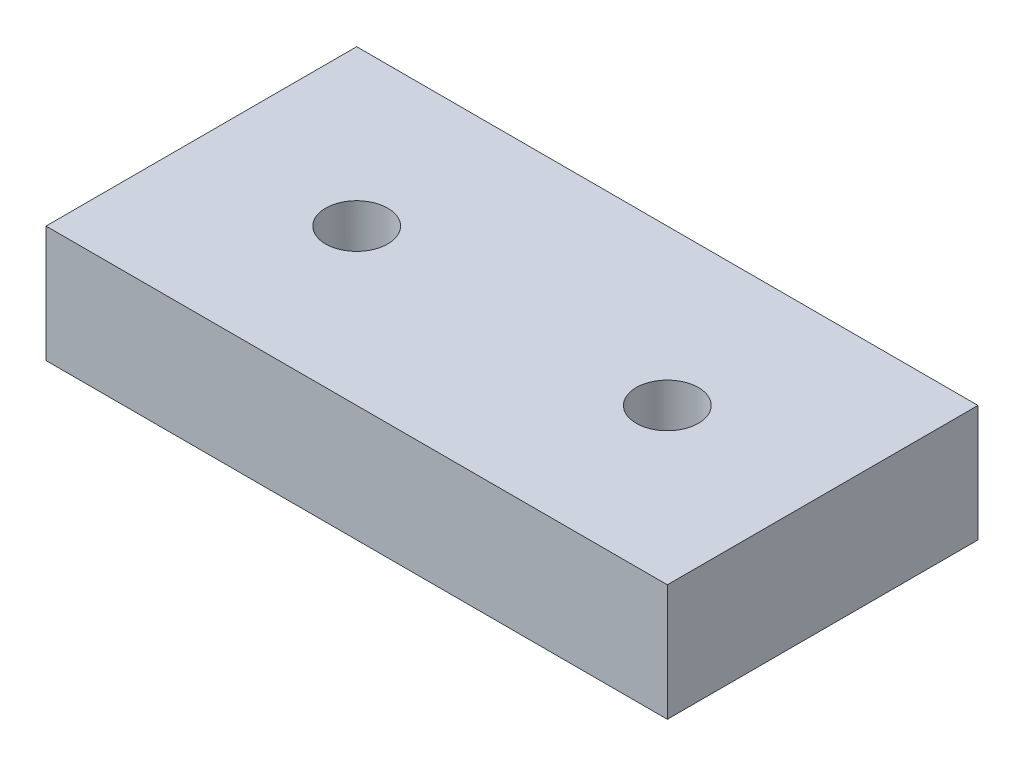
ISO-10303-21;
HEADER;
FILE_DESCRIPTION(('STEP AP214'),'2;1');
FILE_NAME('part.step','',(''),(''),'','','');
FILE_SCHEMA(('AUTOMOTIVE_DESIGN { 1 0 10303 214 1 1 1 1 }'));
ENDSEC;
DATA;
#1=APPLICATION_CONTEXT('core data for automotive mechanical design processes');
#2=APPLICATION_PROTOCOL_DEFINITION('international standard','automotive_design',2000,#1);
#3=PRODUCT_CONTEXT('',#1,'mechanical');
#4=PRODUCT('Part','Part','',(#3));
#5=PRODUCT_RELATED_PRODUCT_CATEGORY('part','',(#4));
#6=PRODUCT_DEFINITION_FORMATION('','',#4);
#7=PRODUCT_DEFINITION_CONTEXT('part definition',#1,'design');
#8=PRODUCT_DEFINITION('design','',#6,#7);
#9=PRODUCT_DEFINITION_SHAPE('','',#8);
#10=(LENGTH_UNIT() NAMED_UNIT(*) SI_UNIT(.MILLI.,.METRE.));
#11=(NAMED_UNIT(*) PLANE_ANGLE_UNIT() SI_UNIT($,.RADIAN.));
#12=(NAMED_UNIT(*) SI_UNIT($,.STERADIAN.) SOLID_ANGLE_UNIT());
#13=UNCERTAINTY_MEASURE_WITH_UNIT(LENGTH_MEASURE(1.E-05),#10,'distance_accuracy_value','');
#14=(GEOMETRIC_REPRESENTATION_CONTEXT(3) GLOBAL_UNCERTAINTY_ASSIGNED_CONTEXT((#13)) GLOBAL_UNIT_ASSIGNED_CONTEXT((#10,
#11,#12)) REPRESENTATION_CONTEXT('',''));
#15=CARTESIAN_POINT('',(0.,0.,0.));
#16=DIRECTION('',(0.,0.,1.));
#17=DIRECTION('',(1.,0.,0.));
#18=AXIS2_PLACEMENT_3D('',#15,#16,#17);
#19=CARTESIAN_POINT('',(0.,0.,0.));
#20=DIRECTION('',(0.,-1.,0.));
#21=DIRECTION('',(0.,0.,-1.));
#22=AXIS2_PLACEMENT_3D('',#19,#20,#21);
#23=PLANE('',#22);
#24=CARTESIAN_POINT('',(-9.99999999999999,0.,0.));
#25=DIRECTION('',(0.,-1.,0.));
#26=DIRECTION('',(0.,0.,-1.));
#27=AXIS2_PLACEMENT_3D('',#24,#25,#26);
#28=CIRCLE('',#27,6.);
#29=CARTESIAN_POINT('',(-9.99999999999999,0.,-6.));
#30=VERTEX_POINT('',#29);
#31=EDGE_CURVE('E264',#30,#30,#28,.T.);
#32=ORIENTED_EDGE('',*,*,#31,.F.);
#33=EDGE_LOOP('',(#32));
#34=FACE_BOUND('',#33,.T.);
#35=CARTESIAN_POINT('',(-9.99999999999999,0.,0.));
#36=DIRECTION('',(0.,-1.,0.));
#37=DIRECTION('',(0.,0.,-1.));
#38=AXIS2_PLACEMENT_3D('',#35,#36,#37);
#39=CIRCLE('',#38,7.);
#40=CARTESIAN_POINT('',(-9.99999999999999,0.,-7.));
#41=VERTEX_POINT('',#40);
#42=EDGE_CURVE('E252',#41,#41,#39,.T.);
#43=ORIENTED_EDGE('',*,*,#42,.T.);
#44=EDGE_LOOP('',(#43));
#45=FACE_BOUND('',#44,.T.);
#46=ADVANCED_FACE('F43',(#34,#45),#23,.T.);
#47=CARTESIAN_POINT('',(10.,0.,0.));
#48=DIRECTION('',(0.,-1.,0.));
#49=DIRECTION('',(0.,0.,-1.));
#50=AXIS2_PLACEMENT_3D('',#47,#48,#49);
#51=CIRCLE('',#50,6.);
#52=CARTESIAN_POINT('',(10.,0.,-6.));
#53=VERTEX_POINT('',#52);
#54=EDGE_CURVE('E267',#53,#53,#51,.T.);
#55=ORIENTED_EDGE('',*,*,#54,.F.);
#56=EDGE_LOOP('',(#55));
#57=FACE_BOUND('',#56,.T.);
#58=CARTESIAN_POINT('',(10.,0.,0.));
#59=DIRECTION('',(0.,-1.,0.));
#60=DIRECTION('',(0.,0.,-1.));
#61=AXIS2_PLACEMENT_3D('',#58,#59,#60);
#62=CIRCLE('',#61,7.);
#63=CARTESIAN_POINT('',(10.,0.,-7.));
#64=VERTEX_POINT('',#63);
#65=EDGE_CURVE('E249',#64,#64,#62,.T.);
#66=ORIENTED_EDGE('',*,*,#65,.T.);
#67=EDGE_LOOP('',(#66));
#68=FACE_BOUND('',#67,.T.);
#69=ADVANCED_FACE('F305',(#57,#68),#23,.T.);
#70=DIRECTION('',(0.,0.,1.));
#71=VECTOR('',#70,1.);
#72=CARTESIAN_POINT('',(-20.,0.,-10.));
#73=LINE('',#72,#71);
#74=CARTESIAN_POINT('',(-20.,0.,-10.));
#75=VERTEX_POINT('',#74);
#76=CARTESIAN_POINT('',(-20.,0.,10.));
#77=VERTEX_POINT('',#76);
#78=EDGE_CURVE('E156',#75,#77,#73,.T.);
#79=ORIENTED_EDGE('',*,*,#78,.F.);
#80=DIRECTION('',(-1.,0.,0.));
#81=VECTOR('',#80,1.);
#82=CARTESIAN_POINT('',(20.,0.,-10.));
#83=LINE('',#82,#81);
#84=CARTESIAN_POINT('',(20.,0.,-10.));
#85=VERTEX_POINT('',#84);
#86=EDGE_CURVE('E152',#85,#75,#83,.T.);
#87=ORIENTED_EDGE('',*,*,#86,.F.);
#88=DIRECTION('',(0.,0.,-1.));
#89=VECTOR('',#88,1.);
#90=CARTESIAN_POINT('',(20.,0.,-10.));
#91=LINE('',#90,#89);
#92=CARTESIAN_POINT('',(20.,0.,9.99999999999999));
#93=VERTEX_POINT('',#92);
#94=EDGE_CURVE('E283',#93,#85,#91,.T.);
#95=ORIENTED_EDGE('',*,*,#94,.F.);
#96=DIRECTION('',(1.,0.,0.));
#97=VECTOR('',#96,1.);
#98=CARTESIAN_POINT('',(20.,0.,9.99999999999999));
#99=LINE('',#98,#97);
#100=EDGE_CURVE('E281',#77,#93,#99,.T.);
#101=ORIENTED_EDGE('',*,*,#100,.F.);
#102=EDGE_LOOP('',(#79,#87,#95,#101));
#103=FACE_BOUND('',#102,.T.);
#104=DIRECTION('',(0.,0.,-1.));
#105=VECTOR('',#104,1.);
#106=CARTESIAN_POINT('',(19.,0.,0.));
#107=LINE('',#106,#105);
#108=CARTESIAN_POINT('',(19.,0.,4.99999999999999));
#109=VERTEX_POINT('',#108);
#110=CARTESIAN_POINT('',(19.,0.,-5.00000000000001));
#111=VERTEX_POINT('',#110);
#112=EDGE_CURVE('E203',#109,#111,#107,.T.);
#113=ORIENTED_EDGE('',*,*,#112,.T.);
#114=CARTESIAN_POINT('',(15.,0.,-5.00000000000001));
#115=DIRECTION('',(0.,-1.,0.));
#116=DIRECTION('',(0.,0.,-1.));
#117=AXIS2_PLACEMENT_3D('',#114,#115,#116);
#118=CIRCLE('',#117,4.);
#119=CARTESIAN_POINT('',(15.,0.,-9.00000000000001));
#120=VERTEX_POINT('',#119);
#121=EDGE_CURVE('E199',#111,#120,#118,.F.);
#122=ORIENTED_EDGE('',*,*,#121,.T.);
#123=DIRECTION('',(-1.,0.,0.));
#124=VECTOR('',#123,1.);
#125=CARTESIAN_POINT('',(0.,0.,-9.00000000000001));
#126=LINE('',#125,#124);
#127=CARTESIAN_POINT('',(-15.,0.,-9.00000000000001));
#128=VERTEX_POINT('',#127);
#129=EDGE_CURVE('E210',#120,#128,#126,.T.);
#130=ORIENTED_EDGE('',*,*,#129,.T.);
#131=CARTESIAN_POINT('',(-15.,0.,-5.));
#132=DIRECTION('',(0.,-1.,0.));
#133=DIRECTION('',(0.,0.,-1.));
#134=AXIS2_PLACEMENT_3D('',#131,#132,#133);
#135=CIRCLE('',#134,4.);
#136=CARTESIAN_POINT('',(-19.,0.,-5.));
#137=VERTEX_POINT('',#136);
#138=EDGE_CURVE('E197',#128,#137,#135,.F.);
#139=ORIENTED_EDGE('',*,*,#138,.T.);
#140=DIRECTION('',(0.,0.,1.));
#141=VECTOR('',#140,1.);
#142=CARTESIAN_POINT('',(-19.,0.,0.));
#143=LINE('',#142,#141);
#144=CARTESIAN_POINT('',(-19.,0.,5.));
#145=VERTEX_POINT('',#144);
#146=EDGE_CURVE('E255',#137,#145,#143,.T.);
#147=ORIENTED_EDGE('',*,*,#146,.T.);
#148=CARTESIAN_POINT('',(-15.,0.,5.));
#149=DIRECTION('',(0.,-1.,0.));
#150=DIRECTION('',(0.,0.,-1.));
#151=AXIS2_PLACEMENT_3D('',#148,#149,#150);
#152=CIRCLE('',#151,4.);
#153=CARTESIAN_POINT('',(-15.,0.,8.99999999999999));
#154=VERTEX_POINT('',#153);
#155=EDGE_CURVE('E11',#145,#154,#152,.F.);
#156=ORIENTED_EDGE('',*,*,#155,.T.);
#157=DIRECTION('',(1.,0.,0.));
#158=VECTOR('',#157,1.);
#159=CARTESIAN_POINT('',(0.,0.,8.99999999999999));
#160=LINE('',#159,#158);
#161=CARTESIAN_POINT('',(15.,0.,8.99999999999999));
#162=VERTEX_POINT('',#161);
#163=EDGE_CURVE('E204',#154,#162,#160,.T.);
#164=ORIENTED_EDGE('',*,*,#163,.T.);
#165=CARTESIAN_POINT('',(15.,0.,4.99999999999999));
#166=DIRECTION('',(0.,-1.,0.));
#167=DIRECTION('',(0.,0.,-1.));
#168=AXIS2_PLACEMENT_3D('',#165,#166,#167);
#169=CIRCLE('',#168,4.);
#170=EDGE_CURVE('E51',#162,#109,#169,.F.);
#171=ORIENTED_EDGE('',*,*,#170,.T.);
#172=EDGE_LOOP('',(#113,#122,#130,#139,#147,#156,#164,#171));
#173=FACE_BOUND('',#172,.T.);
#174=ADVANCED_FACE('F202',(#103,#173),#23,.T.);
#175=CARTESIAN_POINT('',(-9.99999999999999,7.5,0.));
#176=DIRECTION('',(0.,-1.,0.));
#177=DIRECTION('',(0.,0.,-1.));
#178=AXIS2_PLACEMENT_3D('',#175,#176,#177);
#179=CYLINDRICAL_SURFACE('',#178,2.);
#180=CARTESIAN_POINT('',(-9.99999999999999,7.5,0.));
#181=DIRECTION('',(0.,1.,0.));
#182=DIRECTION('',(0.,0.,1.));
#183=AXIS2_PLACEMENT_3D('',#180,#181,#182);
#184=CIRCLE('',#183,2.);
#185=CARTESIAN_POINT('',(-9.99999999999999,7.5,2.));
#186=VERTEX_POINT('',#185);
#187=EDGE_CURVE('E274',#186,#186,#184,.T.);
#188=ORIENTED_EDGE('',*,*,#187,.T.);
#189=EDGE_LOOP('',(#188));
#190=FACE_BOUND('',#189,.T.);
#191=CARTESIAN_POINT('',(-9.99999999999999,4.,0.));
#192=DIRECTION('',(0.,-1.,0.));
#193=DIRECTION('',(0.,0.,-1.));
#194=AXIS2_PLACEMENT_3D('',#191,#192,#193);
#195=CIRCLE('',#194,2.);
#196=CARTESIAN_POINT('',(-9.99999999999999,4.,-2.));
#197=VERTEX_POINT('',#196);
#198=EDGE_CURVE('E168',#197,#197,#195,.T.);
#199=ORIENTED_EDGE('',*,*,#198,.T.);
#200=EDGE_LOOP('',(#199));
#201=FACE_BOUND('',#200,.T.);
#202=ADVANCED_FACE('F317',(#190,#201),#179,.F.);
#203=CARTESIAN_POINT('',(10.,7.5,0.));
#204=DIRECTION('',(0.,-1.,0.));
#205=DIRECTION('',(0.,0.,-1.));
#206=AXIS2_PLACEMENT_3D('',#203,#204,#205);
#207=CYLINDRICAL_SURFACE('',#206,2.);
#208=CARTESIAN_POINT('',(10.,7.5,0.));
#209=DIRECTION('',(0.,1.,0.));
#210=DIRECTION('',(0.,0.,1.));
#211=AXIS2_PLACEMENT_3D('',#208,#209,#210);
#212=CIRCLE('',#211,2.);
#213=CARTESIAN_POINT('',(10.,7.5,2.));
#214=VERTEX_POINT('',#213);
#215=EDGE_CURVE('E171',#214,#214,#212,.T.);
#216=ORIENTED_EDGE('',*,*,#215,.T.);
#217=EDGE_LOOP('',(#216));
#218=FACE_BOUND('',#217,.T.);
#219=CARTESIAN_POINT('',(10.,4.,0.));
#220=DIRECTION('',(0.,-1.,0.));
#221=DIRECTION('',(0.,0.,-1.));
#222=AXIS2_PLACEMENT_3D('',#219,#220,#221);
#223=CIRCLE('',#222,2.);
#224=CARTESIAN_POINT('',(10.,4.,-2.));
#225=VERTEX_POINT('',#224);
#226=EDGE_CURVE('E165',#225,#225,#223,.T.);
#227=ORIENTED_EDGE('',*,*,#226,.T.);
#228=EDGE_LOOP('',(#227));
#229=FACE_BOUND('',#228,.T.);
#230=ADVANCED_FACE('F321',(#218,#229),#207,.F.);
#231=CARTESIAN_POINT('',(0.,7.5,0.));
#232=DIRECTION('',(0.,-1.,0.));
#233=DIRECTION('',(0.,0.,-1.));
#234=AXIS2_PLACEMENT_3D('',#231,#232,#233);
#235=PLANE('',#234);
#236=DIRECTION('',(0.,0.,1.));
#237=VECTOR('',#236,1.);
#238=CARTESIAN_POINT('',(-20.,7.5,-10.));
#239=LINE('',#238,#237);
#240=CARTESIAN_POINT('',(-20.,7.5,-10.));
#241=VERTEX_POINT('',#240);
#242=CARTESIAN_POINT('',(-20.,7.5,10.));
#243=VERTEX_POINT('',#242);
#244=EDGE_CURVE('E142',#241,#243,#239,.T.);
#245=ORIENTED_EDGE('',*,*,#244,.T.);
#246=DIRECTION('',(1.,0.,0.));
#247=VECTOR('',#246,1.);
#248=CARTESIAN_POINT('',(20.,7.5,9.99999999999999));
#249=LINE('',#248,#247);
#250=CARTESIAN_POINT('',(20.,7.5,9.99999999999999));
#251=VERTEX_POINT('',#250);
#252=EDGE_CURVE('E131',#243,#251,#249,.T.);
#253=ORIENTED_EDGE('',*,*,#252,.T.);
#254=DIRECTION('',(0.,0.,-1.));
#255=VECTOR('',#254,1.);
#256=CARTESIAN_POINT('',(20.,7.5,-10.));
#257=LINE('',#256,#255);
#258=CARTESIAN_POINT('',(20.,7.5,-10.));
#259=VERTEX_POINT('',#258);
#260=EDGE_CURVE('E141',#251,#259,#257,.T.);
#261=ORIENTED_EDGE('',*,*,#260,.T.);
#262=DIRECTION('',(-1.,0.,0.));
#263=VECTOR('',#262,1.);
#264=CARTESIAN_POINT('',(20.,7.5,-10.));
#265=LINE('',#264,#263);
#266=EDGE_CURVE('E148',#259,#241,#265,.T.);
#267=ORIENTED_EDGE('',*,*,#266,.T.);
#268=EDGE_LOOP('',(#245,#253,#261,#267));
#269=FACE_BOUND('',#268,.T.);
#270=ORIENTED_EDGE('',*,*,#187,.F.);
#271=EDGE_LOOP('',(#270));
#272=FACE_BOUND('',#271,.T.);
#273=ORIENTED_EDGE('',*,*,#215,.F.);
#274=EDGE_LOOP('',(#273));
#275=FACE_BOUND('',#274,.T.);
#276=ADVANCED_FACE('F145',(#269,#272,#275),#235,.F.);
#277=CARTESIAN_POINT('',(-20.,7.5,-10.));
#278=DIRECTION('',(1.,0.,0.));
#279=DIRECTION('',(0.,0.,-1.));
#280=AXIS2_PLACEMENT_3D('',#277,#278,#279);
#281=PLANE('',#280);
#282=ORIENTED_EDGE('',*,*,#78,.T.);
#283=DIRECTION('',(0.,-1.,0.));
#284=VECTOR('',#283,1.);
#285=CARTESIAN_POINT('',(-20.,7.5,10.));
#286=LINE('',#285,#284);
#287=EDGE_CURVE('E135',#243,#77,#286,.T.);
#288=ORIENTED_EDGE('',*,*,#287,.F.);
#289=ORIENTED_EDGE('',*,*,#244,.F.);
#290=DIRECTION('',(0.,-1.,0.));
#291=VECTOR('',#290,1.);
#292=CARTESIAN_POINT('',(-20.,7.5,-10.));
#293=LINE('',#292,#291);
#294=EDGE_CURVE('E279',#241,#75,#293,.T.);
#295=ORIENTED_EDGE('',*,*,#294,.T.);
#296=EDGE_LOOP('',(#282,#288,#289,#295));
#297=FACE_BOUND('',#296,.T.);
#298=ADVANCED_FACE('F154',(#297),#281,.F.);
#299=CARTESIAN_POINT('',(20.,7.5,9.99999999999999));
#300=DIRECTION('',(0.,0.,-1.));
#301=DIRECTION('',(-1.,0.,0.));
#302=AXIS2_PLACEMENT_3D('',#299,#300,#301);
#303=PLANE('',#302);
#304=ORIENTED_EDGE('',*,*,#100,.T.);
#305=DIRECTION('',(0.,-1.,0.));
#306=VECTOR('',#305,1.);
#307=CARTESIAN_POINT('',(20.,7.5,9.99999999999999));
#308=LINE('',#307,#306);
#309=EDGE_CURVE('E138',#251,#93,#308,.T.);
#310=ORIENTED_EDGE('',*,*,#309,.F.);
#311=ORIENTED_EDGE('',*,*,#252,.F.);
#312=ORIENTED_EDGE('',*,*,#287,.T.);
#313=EDGE_LOOP('',(#304,#310,#311,#312));
#314=FACE_BOUND('',#313,.T.);
#315=ADVANCED_FACE('F133',(#314),#303,.F.);
#316=CARTESIAN_POINT('',(20.,7.5,-10.));
#317=DIRECTION('',(-1.,0.,0.));
#318=DIRECTION('',(0.,0.,1.));
#319=AXIS2_PLACEMENT_3D('',#316,#317,#318);
#320=PLANE('',#319);
#321=ORIENTED_EDGE('',*,*,#94,.T.);
#322=DIRECTION('',(0.,-1.,0.));
#323=VECTOR('',#322,1.);
#324=CARTESIAN_POINT('',(20.,7.5,-10.));
#325=LINE('',#324,#323);
#326=EDGE_CURVE('E161',#259,#85,#325,.T.);
#327=ORIENTED_EDGE('',*,*,#326,.F.);
#328=ORIENTED_EDGE('',*,*,#260,.F.);
#329=ORIENTED_EDGE('',*,*,#309,.T.);
#330=EDGE_LOOP('',(#321,#327,#328,#329));
#331=FACE_BOUND('',#330,.T.);
#332=ADVANCED_FACE('F294',(#331),#320,.F.);
#333=CARTESIAN_POINT('',(20.,7.5,-10.));
#334=DIRECTION('',(0.,0.,1.));
#335=DIRECTION('',(1.,0.,0.));
#336=AXIS2_PLACEMENT_3D('',#333,#334,#335);
#337=PLANE('',#336);
#338=ORIENTED_EDGE('',*,*,#86,.T.);
#339=ORIENTED_EDGE('',*,*,#294,.F.);
#340=ORIENTED_EDGE('',*,*,#266,.F.);
#341=ORIENTED_EDGE('',*,*,#326,.T.);
#342=EDGE_LOOP('',(#338,#339,#340,#341));
#343=FACE_BOUND('',#342,.T.);
#344=ADVANCED_FACE('F290',(#343),#337,.F.);
#345=CARTESIAN_POINT('',(10.,4.,0.));
#346=DIRECTION('',(0.,-1.,0.));
#347=DIRECTION('',(0.,0.,-1.));
#348=AXIS2_PLACEMENT_3D('',#345,#346,#347);
#349=CYLINDRICAL_SURFACE('',#348,6.);
#350=CARTESIAN_POINT('',(10.,4.,0.));
#351=DIRECTION('',(0.,-1.,0.));
#352=DIRECTION('',(0.,0.,-1.));
#353=AXIS2_PLACEMENT_3D('',#350,#351,#352);
#354=CIRCLE('',#353,6.);
#355=CARTESIAN_POINT('',(10.,4.,-6.));
#356=VERTEX_POINT('',#355);
#357=EDGE_CURVE('E236',#356,#356,#354,.T.);
#358=ORIENTED_EDGE('',*,*,#357,.F.);
#359=EDGE_LOOP('',(#358));
#360=FACE_BOUND('',#359,.T.);
#361=ORIENTED_EDGE('',*,*,#54,.T.);
#362=EDGE_LOOP('',(#361));
#363=FACE_BOUND('',#362,.T.);
#364=ADVANCED_FACE('F301',(#360,#363),#349,.F.);
#365=CARTESIAN_POINT('',(10.,4.,0.));
#366=DIRECTION('',(0.,-1.,0.));
#367=DIRECTION('',(0.,0.,-1.));
#368=AXIS2_PLACEMENT_3D('',#365,#366,#367);
#369=PLANE('',#368);
#370=ORIENTED_EDGE('',*,*,#226,.F.);
#371=EDGE_LOOP('',(#370));
#372=FACE_BOUND('',#371,.T.);
#373=ORIENTED_EDGE('',*,*,#357,.T.);
#374=EDGE_LOOP('',(#373));
#375=FACE_BOUND('',#374,.T.);
#376=ADVANCED_FACE('F398',(#372,#375),#369,.T.);
#377=CARTESIAN_POINT('',(-9.99999999999999,4.,0.));
#378=DIRECTION('',(0.,-1.,0.));
#379=DIRECTION('',(0.,0.,-1.));
#380=AXIS2_PLACEMENT_3D('',#377,#378,#379);
#381=CYLINDRICAL_SURFACE('',#380,6.);
#382=CARTESIAN_POINT('',(-9.99999999999999,4.,0.));
#383=DIRECTION('',(0.,-1.,0.));
#384=DIRECTION('',(0.,0.,-1.));
#385=AXIS2_PLACEMENT_3D('',#382,#383,#384);
#386=CIRCLE('',#385,6.);
#387=CARTESIAN_POINT('',(-9.99999999999999,4.,-6.));
#388=VERTEX_POINT('',#387);
#389=EDGE_CURVE('E169',#388,#388,#386,.T.);
#390=ORIENTED_EDGE('',*,*,#389,.F.);
#391=EDGE_LOOP('',(#390));
#392=FACE_BOUND('',#391,.T.);
#393=ORIENTED_EDGE('',*,*,#31,.T.);
#394=EDGE_LOOP('',(#393));
#395=FACE_BOUND('',#394,.T.);
#396=ADVANCED_FACE('F394',(#392,#395),#381,.F.);
#397=CARTESIAN_POINT('',(-9.99999999999999,4.,0.));
#398=DIRECTION('',(0.,-1.,0.));
#399=DIRECTION('',(0.,0.,-1.));
#400=AXIS2_PLACEMENT_3D('',#397,#398,#399);
#401=PLANE('',#400);
#402=ORIENTED_EDGE('',*,*,#198,.F.);
#403=EDGE_LOOP('',(#402));
#404=FACE_BOUND('',#403,.T.);
#405=ORIENTED_EDGE('',*,*,#389,.T.);
#406=EDGE_LOOP('',(#405));
#407=FACE_BOUND('',#406,.T.);
#408=ADVANCED_FACE('F390',(#404,#407),#401,.T.);
#409=CARTESIAN_POINT('',(-9.99999999999999,7.5,0.));
#410=DIRECTION('',(0.,-1.,0.));
#411=DIRECTION('',(0.,0.,-1.));
#412=AXIS2_PLACEMENT_3D('',#409,#410,#411);
#413=CYLINDRICAL_SURFACE('',#412,3.);
#414=CARTESIAN_POINT('',(-9.99999999999999,6.5,0.));
#415=DIRECTION('',(0.,-1.,0.));
#416=DIRECTION('',(0.,0.,-1.));
#417=AXIS2_PLACEMENT_3D('',#414,#415,#416);
#418=CIRCLE('',#417,3.);
#419=CARTESIAN_POINT('',(-9.99999999999999,6.5,-3.));
#420=VERTEX_POINT('',#419);
#421=EDGE_CURVE('E240',#420,#420,#418,.F.);
#422=ORIENTED_EDGE('',*,*,#421,.F.);
#423=EDGE_LOOP('',(#422));
#424=FACE_BOUND('',#423,.T.);
#425=CARTESIAN_POINT('',(-9.99999999999999,5.,0.));
#426=DIRECTION('',(0.,-1.,0.));
#427=DIRECTION('',(0.,0.,-1.));
#428=AXIS2_PLACEMENT_3D('',#425,#426,#427);
#429=CIRCLE('',#428,3.);
#430=CARTESIAN_POINT('',(-9.99999999999999,5.,-3.));
#431=VERTEX_POINT('',#430);
#432=EDGE_CURVE('E241',#431,#431,#429,.T.);
#433=ORIENTED_EDGE('',*,*,#432,.F.);
#434=EDGE_LOOP('',(#433));
#435=FACE_BOUND('',#434,.T.);
#436=ADVANCED_FACE('F393',(#424,#435),#413,.T.);
#437=CARTESIAN_POINT('',(10.,7.5,0.));
#438=DIRECTION('',(0.,-1.,0.));
#439=DIRECTION('',(0.,0.,-1.));
#440=AXIS2_PLACEMENT_3D('',#437,#438,#439);
#441=CYLINDRICAL_SURFACE('',#440,3.);
#442=CARTESIAN_POINT('',(10.,6.5,0.));
#443=DIRECTION('',(0.,-1.,0.));
#444=DIRECTION('',(0.,0.,-1.));
#445=AXIS2_PLACEMENT_3D('',#442,#443,#444);
#446=CIRCLE('',#445,3.);
#447=CARTESIAN_POINT('',(10.,6.5,-3.));
#448=VERTEX_POINT('',#447);
#449=EDGE_CURVE('E237',#448,#448,#446,.F.);
#450=ORIENTED_EDGE('',*,*,#449,.F.);
#451=EDGE_LOOP('',(#450));
#452=FACE_BOUND('',#451,.T.);
#453=CARTESIAN_POINT('',(10.,5.,0.));
#454=DIRECTION('',(0.,-1.,0.));
#455=DIRECTION('',(0.,0.,-1.));
#456=AXIS2_PLACEMENT_3D('',#453,#454,#455);
#457=CIRCLE('',#456,3.);
#458=CARTESIAN_POINT('',(10.,5.,-3.));
#459=VERTEX_POINT('',#458);
#460=EDGE_CURVE('E242',#459,#459,#457,.T.);
#461=ORIENTED_EDGE('',*,*,#460,.F.);
#462=EDGE_LOOP('',(#461));
#463=FACE_BOUND('',#462,.T.);
#464=ADVANCED_FACE('F449',(#452,#463),#441,.T.);
#465=CARTESIAN_POINT('',(0.,6.5,0.));
#466=DIRECTION('',(0.,-1.,0.));
#467=DIRECTION('',(0.,0.,-1.));
#468=AXIS2_PLACEMENT_3D('',#465,#466,#467);
#469=PLANE('',#468);
#470=DIRECTION('',(0.,0.,1.));
#471=VECTOR('',#470,1.);
#472=CARTESIAN_POINT('',(-19.,6.5,0.));
#473=LINE('',#472,#471);
#474=CARTESIAN_POINT('',(-19.,6.5,-5.));
#475=VERTEX_POINT('',#474);
#476=CARTESIAN_POINT('',(-19.,6.5,5.));
#477=VERTEX_POINT('',#476);
#478=EDGE_CURVE('E226',#475,#477,#473,.T.);
#479=ORIENTED_EDGE('',*,*,#478,.F.);
#480=CARTESIAN_POINT('',(-15.,6.5,-5.));
#481=DIRECTION('',(0.,-1.,0.));
#482=DIRECTION('',(0.,0.,-1.));
#483=AXIS2_PLACEMENT_3D('',#480,#481,#482);
#484=CIRCLE('',#483,4.);
#485=CARTESIAN_POINT('',(-15.,6.5,-9.00000000000001));
#486=VERTEX_POINT('',#485);
#487=EDGE_CURVE('E186',#475,#486,#484,.T.);
#488=ORIENTED_EDGE('',*,*,#487,.T.);
#489=DIRECTION('',(-1.,0.,0.));
#490=VECTOR('',#489,1.);
#491=CARTESIAN_POINT('',(0.,6.5,-9.00000000000001));
#492=LINE('',#491,#490);
#493=CARTESIAN_POINT('',(15.,6.5,-9.00000000000001));
#494=VERTEX_POINT('',#493);
#495=EDGE_CURVE('E228',#494,#486,#492,.T.);
#496=ORIENTED_EDGE('',*,*,#495,.F.);
#497=CARTESIAN_POINT('',(15.,6.5,-5.00000000000001));
#498=DIRECTION('',(0.,-1.,0.));
#499=DIRECTION('',(0.,0.,-1.));
#500=AXIS2_PLACEMENT_3D('',#497,#498,#499);
#501=CIRCLE('',#500,4.);
#502=CARTESIAN_POINT('',(19.,6.5,-5.00000000000001));
#503=VERTEX_POINT('',#502);
#504=EDGE_CURVE('E184',#494,#503,#501,.T.);
#505=ORIENTED_EDGE('',*,*,#504,.T.);
#506=DIRECTION('',(0.,0.,-1.));
#507=VECTOR('',#506,1.);
#508=CARTESIAN_POINT('',(19.,6.5,0.));
#509=LINE('',#508,#507);
#510=CARTESIAN_POINT('',(19.,6.5,4.99999999999999));
#511=VERTEX_POINT('',#510);
#512=EDGE_CURVE('E222',#511,#503,#509,.T.);
#513=ORIENTED_EDGE('',*,*,#512,.F.);
#514=CARTESIAN_POINT('',(15.,6.5,4.99999999999999));
#515=DIRECTION('',(0.,-1.,0.));
#516=DIRECTION('',(0.,0.,-1.));
#517=AXIS2_PLACEMENT_3D('',#514,#515,#516);
#518=CIRCLE('',#517,4.);
#519=CARTESIAN_POINT('',(15.,6.5,8.99999999999999));
#520=VERTEX_POINT('',#519);
#521=EDGE_CURVE('E182',#511,#520,#518,.T.);
#522=ORIENTED_EDGE('',*,*,#521,.T.);
#523=DIRECTION('',(1.,0.,0.));
#524=VECTOR('',#523,1.);
#525=CARTESIAN_POINT('',(0.,6.5,8.99999999999999));
#526=LINE('',#525,#524);
#527=CARTESIAN_POINT('',(-15.,6.5,8.99999999999999));
#528=VERTEX_POINT('',#527);
#529=EDGE_CURVE('E220',#528,#520,#526,.T.);
#530=ORIENTED_EDGE('',*,*,#529,.F.);
#531=CARTESIAN_POINT('',(-15.,6.5,5.));
#532=DIRECTION('',(0.,-1.,0.));
#533=DIRECTION('',(0.,0.,-1.));
#534=AXIS2_PLACEMENT_3D('',#531,#532,#533);
#535=CIRCLE('',#534,4.);
#536=EDGE_CURVE('E180',#528,#477,#535,.T.);
#537=ORIENTED_EDGE('',*,*,#536,.T.);
#538=EDGE_LOOP('',(#479,#488,#496,#505,#513,#522,#530,#537));
#539=FACE_BOUND('',#538,.T.);
#540=ORIENTED_EDGE('',*,*,#421,.T.);
#541=EDGE_LOOP('',(#540));
#542=FACE_BOUND('',#541,.T.);
#543=ORIENTED_EDGE('',*,*,#449,.T.);
#544=EDGE_LOOP('',(#543));
#545=FACE_BOUND('',#544,.T.);
#546=ADVANCED_FACE('F218',(#539,#542,#545),#469,.T.);
#547=CARTESIAN_POINT('',(-19.,7.5,-10.));
#548=DIRECTION('',(1.,0.,0.));
#549=DIRECTION('',(0.,0.,-1.));
#550=AXIS2_PLACEMENT_3D('',#547,#548,#549);
#551=PLANE('',#550);
#552=ORIENTED_EDGE('',*,*,#146,.F.);
#553=DIRECTION('',(0.,-1.,0.));
#554=VECTOR('',#553,1.);
#555=CARTESIAN_POINT('',(-19.,6.5,-5.));
#556=LINE('',#555,#554);
#557=EDGE_CURVE('E178',#137,#475,#556,.F.);
#558=ORIENTED_EDGE('',*,*,#557,.T.);
#559=ORIENTED_EDGE('',*,*,#478,.T.);
#560=DIRECTION('',(0.,-1.,0.));
#561=VECTOR('',#560,1.);
#562=CARTESIAN_POINT('',(-19.,0.,5.));
#563=LINE('',#562,#561);
#564=EDGE_CURVE('E175',#477,#145,#563,.T.);
#565=ORIENTED_EDGE('',*,*,#564,.T.);
#566=EDGE_LOOP('',(#552,#558,#559,#565));
#567=FACE_BOUND('',#566,.T.);
#568=ADVANCED_FACE('F358',(#567),#551,.T.);
#569=CARTESIAN_POINT('',(20.,7.5,8.99999999999999));
#570=DIRECTION('',(0.,0.,-1.));
#571=DIRECTION('',(-1.,0.,0.));
#572=AXIS2_PLACEMENT_3D('',#569,#570,#571);
#573=PLANE('',#572);
#574=ORIENTED_EDGE('',*,*,#529,.T.);
#575=DIRECTION('',(0.,-1.,0.));
#576=VECTOR('',#575,1.);
#577=CARTESIAN_POINT('',(15.,0.,8.99999999999999));
#578=LINE('',#577,#576);
#579=EDGE_CURVE('E195',#520,#162,#578,.T.);
#580=ORIENTED_EDGE('',*,*,#579,.T.);
#581=ORIENTED_EDGE('',*,*,#163,.F.);
#582=DIRECTION('',(0.,-1.,0.));
#583=VECTOR('',#582,1.);
#584=CARTESIAN_POINT('',(-15.,6.5,9.));
#585=LINE('',#584,#583);
#586=EDGE_CURVE('E193',#154,#528,#585,.F.);
#587=ORIENTED_EDGE('',*,*,#586,.T.);
#588=EDGE_LOOP('',(#574,#580,#581,#587));
#589=FACE_BOUND('',#588,.T.);
#590=ADVANCED_FACE('F224',(#589),#573,.T.);
#591=CARTESIAN_POINT('',(19.,7.5,-10.));
#592=DIRECTION('',(-1.,0.,0.));
#593=DIRECTION('',(0.,0.,1.));
#594=AXIS2_PLACEMENT_3D('',#591,#592,#593);
#595=PLANE('',#594);
#596=ORIENTED_EDGE('',*,*,#512,.T.);
#597=DIRECTION('',(0.,-1.,0.));
#598=VECTOR('',#597,1.);
#599=CARTESIAN_POINT('',(19.,0.,-5.00000000000001));
#600=LINE('',#599,#598);
#601=EDGE_CURVE('E190',#503,#111,#600,.T.);
#602=ORIENTED_EDGE('',*,*,#601,.T.);
#603=ORIENTED_EDGE('',*,*,#112,.F.);
#604=DIRECTION('',(0.,-1.,0.));
#605=VECTOR('',#604,1.);
#606=CARTESIAN_POINT('',(19.,6.5,4.99999999999999));
#607=LINE('',#606,#605);
#608=EDGE_CURVE('E188',#109,#511,#607,.F.);
#609=ORIENTED_EDGE('',*,*,#608,.T.);
#610=EDGE_LOOP('',(#596,#602,#603,#609));
#611=FACE_BOUND('',#610,.T.);
#612=ADVANCED_FACE('F207',(#611),#595,.T.);
#613=CARTESIAN_POINT('',(20.,7.5,-9.00000000000001));
#614=DIRECTION('',(0.,0.,1.));
#615=DIRECTION('',(1.,0.,0.));
#616=AXIS2_PLACEMENT_3D('',#613,#614,#615);
#617=PLANE('',#616);
#618=ORIENTED_EDGE('',*,*,#495,.T.);
#619=DIRECTION('',(0.,-1.,0.));
#620=VECTOR('',#619,1.);
#621=CARTESIAN_POINT('',(-15.,0.,-9.));
#622=LINE('',#621,#620);
#623=EDGE_CURVE('E159',#486,#128,#622,.T.);
#624=ORIENTED_EDGE('',*,*,#623,.T.);
#625=ORIENTED_EDGE('',*,*,#129,.F.);
#626=DIRECTION('',(0.,-1.,0.));
#627=VECTOR('',#626,1.);
#628=CARTESIAN_POINT('',(15.,6.5,-9.00000000000001));
#629=LINE('',#628,#627);
#630=EDGE_CURVE('E157',#120,#494,#629,.F.);
#631=ORIENTED_EDGE('',*,*,#630,.T.);
#632=EDGE_LOOP('',(#618,#624,#625,#631));
#633=FACE_BOUND('',#632,.T.);
#634=ADVANCED_FACE('F364',(#633),#617,.T.);
#635=CARTESIAN_POINT('',(10.,4.,0.));
#636=DIRECTION('',(0.,-1.,0.));
#637=DIRECTION('',(0.,0.,-1.));
#638=AXIS2_PLACEMENT_3D('',#635,#636,#637);
#639=CYLINDRICAL_SURFACE('',#638,7.);
#640=CARTESIAN_POINT('',(10.,5.,0.));
#641=DIRECTION('',(0.,-1.,0.));
#642=DIRECTION('',(0.,0.,-1.));
#643=AXIS2_PLACEMENT_3D('',#640,#641,#642);
#644=CIRCLE('',#643,7.);
#645=CARTESIAN_POINT('',(10.,5.,-7.));
#646=VERTEX_POINT('',#645);
#647=EDGE_CURVE('E246',#646,#646,#644,.T.);
#648=ORIENTED_EDGE('',*,*,#647,.T.);
#649=EDGE_LOOP('',(#648));
#650=FACE_BOUND('',#649,.T.);
#651=ORIENTED_EDGE('',*,*,#65,.F.);
#652=EDGE_LOOP('',(#651));
#653=FACE_BOUND('',#652,.T.);
#654=ADVANCED_FACE('F368',(#650,#653),#639,.T.);
#655=CARTESIAN_POINT('',(10.,5.,0.));
#656=DIRECTION('',(0.,-1.,0.));
#657=DIRECTION('',(0.,0.,-1.));
#658=AXIS2_PLACEMENT_3D('',#655,#656,#657);
#659=PLANE('',#658);
#660=ORIENTED_EDGE('',*,*,#460,.T.);
#661=EDGE_LOOP('',(#660));
#662=FACE_BOUND('',#661,.T.);
#663=ORIENTED_EDGE('',*,*,#647,.F.);
#664=EDGE_LOOP('',(#663));
#665=FACE_BOUND('',#664,.T.);
#666=ADVANCED_FACE('F374',(#662,#665),#659,.F.);
#667=CARTESIAN_POINT('',(-9.99999999999999,4.,0.));
#668=DIRECTION('',(0.,-1.,0.));
#669=DIRECTION('',(0.,0.,-1.));
#670=AXIS2_PLACEMENT_3D('',#667,#668,#669);
#671=CYLINDRICAL_SURFACE('',#670,7.);
#672=CARTESIAN_POINT('',(-9.99999999999999,5.,0.));
#673=DIRECTION('',(0.,-1.,0.));
#674=DIRECTION('',(0.,0.,-1.));
#675=AXIS2_PLACEMENT_3D('',#672,#673,#674);
#676=CIRCLE('',#675,7.);
#677=CARTESIAN_POINT('',(-9.99999999999999,5.,-7.));
#678=VERTEX_POINT('',#677);
#679=EDGE_CURVE('E245',#678,#678,#676,.T.);
#680=ORIENTED_EDGE('',*,*,#679,.T.);
#681=EDGE_LOOP('',(#680));
#682=FACE_BOUND('',#681,.T.);
#683=ORIENTED_EDGE('',*,*,#42,.F.);
#684=EDGE_LOOP('',(#683));
#685=FACE_BOUND('',#684,.T.);
#686=ADVANCED_FACE('F382',(#682,#685),#671,.T.);
#687=CARTESIAN_POINT('',(-9.99999999999999,5.,0.));
#688=DIRECTION('',(0.,-1.,0.));
#689=DIRECTION('',(0.,0.,-1.));
#690=AXIS2_PLACEMENT_3D('',#687,#688,#689);
#691=PLANE('',#690);
#692=ORIENTED_EDGE('',*,*,#432,.T.);
#693=EDGE_LOOP('',(#692));
#694=FACE_BOUND('',#693,.T.);
#695=ORIENTED_EDGE('',*,*,#679,.F.);
#696=EDGE_LOOP('',(#695));
#697=FACE_BOUND('',#696,.T.);
#698=ADVANCED_FACE('F343',(#694,#697),#691,.F.);
#699=CARTESIAN_POINT('',(-15.,7.5,-5.));
#700=DIRECTION('',(0.,1.,0.));
#701=DIRECTION('',(0.,0.,1.));
#702=AXIS2_PLACEMENT_3D('',#699,#700,#701);
#703=CYLINDRICAL_SURFACE('',#702,4.);
#704=ORIENTED_EDGE('',*,*,#487,.F.);
#705=ORIENTED_EDGE('',*,*,#557,.F.);
#706=ORIENTED_EDGE('',*,*,#138,.F.);
#707=ORIENTED_EDGE('',*,*,#623,.F.);
#708=EDGE_LOOP('',(#704,#705,#706,#707));
#709=FACE_BOUND('',#708,.T.);
#710=ADVANCED_FACE('F339',(#709),#703,.F.);
#711=CARTESIAN_POINT('',(15.,7.5,-5.00000000000001));
#712=DIRECTION('',(0.,1.,0.));
#713=DIRECTION('',(0.,0.,1.));
#714=AXIS2_PLACEMENT_3D('',#711,#712,#713);
#715=CYLINDRICAL_SURFACE('',#714,4.);
#716=ORIENTED_EDGE('',*,*,#504,.F.);
#717=ORIENTED_EDGE('',*,*,#630,.F.);
#718=ORIENTED_EDGE('',*,*,#121,.F.);
#719=ORIENTED_EDGE('',*,*,#601,.F.);
#720=EDGE_LOOP('',(#716,#717,#718,#719));
#721=FACE_BOUND('',#720,.T.);
#722=ADVANCED_FACE('F342',(#721),#715,.F.);
#723=CARTESIAN_POINT('',(15.,7.5,4.99999999999999));
#724=DIRECTION('',(0.,1.,0.));
#725=DIRECTION('',(0.,0.,1.));
#726=AXIS2_PLACEMENT_3D('',#723,#724,#725);
#727=CYLINDRICAL_SURFACE('',#726,4.);
#728=ORIENTED_EDGE('',*,*,#521,.F.);
#729=ORIENTED_EDGE('',*,*,#608,.F.);
#730=ORIENTED_EDGE('',*,*,#170,.F.);
#731=ORIENTED_EDGE('',*,*,#579,.F.);
#732=EDGE_LOOP('',(#728,#729,#730,#731));
#733=FACE_BOUND('',#732,.T.);
#734=ADVANCED_FACE('F213',(#733),#727,.F.);
#735=CARTESIAN_POINT('',(-15.,7.5,5.));
#736=DIRECTION('',(0.,1.,0.));
#737=DIRECTION('',(0.,0.,1.));
#738=AXIS2_PLACEMENT_3D('',#735,#736,#737);
#739=CYLINDRICAL_SURFACE('',#738,4.);
#740=ORIENTED_EDGE('',*,*,#536,.F.);
#741=ORIENTED_EDGE('',*,*,#586,.F.);
#742=ORIENTED_EDGE('',*,*,#155,.F.);
#743=ORIENTED_EDGE('',*,*,#564,.F.);
#744=EDGE_LOOP('',(#740,#741,#742,#743));
#745=FACE_BOUND('',#744,.T.);
#746=ADVANCED_FACE('F45',(#745),#739,.F.);
#747=CLOSED_SHELL('',(#46,#69,#174,#202,#230,#276,#298,#315,#332,#344,#364,#376,#396,#408,#436,
#464,#546,#568,#590,#612,#634,#654,#666,#686,#698,#710,#722,#734,#746));
#748=MANIFOLD_SOLID_BREP('B2',#747);
#749=ADVANCED_BREP_SHAPE_REPRESENTATION('',(#18,#748),#14);
#750=SHAPE_DEFINITION_REPRESENTATION(#9,#749);
ENDSEC;
END-ISO-10303-21;
